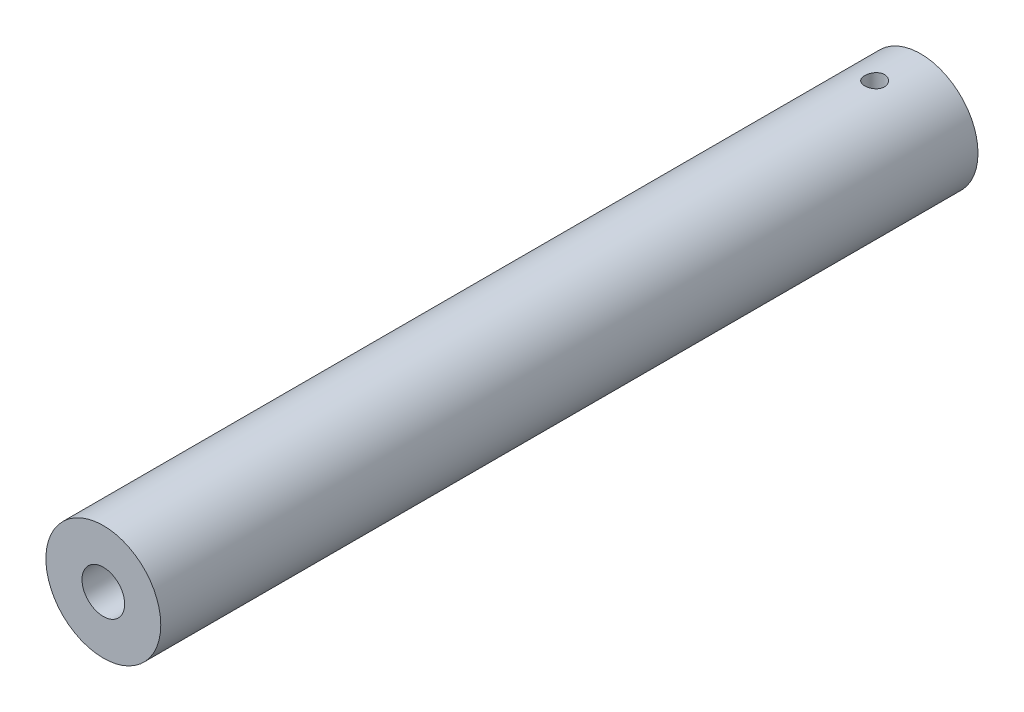
ISO-10303-21;
HEADER;
FILE_DESCRIPTION(('STEP AP214'),'2;1');
FILE_NAME('part.step','',(''),(''),'','','');
FILE_SCHEMA(('AUTOMOTIVE_DESIGN { 1 0 10303 214 1 1 1 1 }'));
ENDSEC;
DATA;
#1=APPLICATION_CONTEXT('core data for automotive mechanical design processes');
#2=APPLICATION_PROTOCOL_DEFINITION('international standard','automotive_design',2000,#1);
#3=PRODUCT_CONTEXT('',#1,'mechanical');
#4=PRODUCT('Part','Part','',(#3));
#5=PRODUCT_RELATED_PRODUCT_CATEGORY('part','',(#4));
#6=PRODUCT_DEFINITION_FORMATION('','',#4);
#7=PRODUCT_DEFINITION_CONTEXT('part definition',#1,'design');
#8=PRODUCT_DEFINITION('design','',#6,#7);
#9=PRODUCT_DEFINITION_SHAPE('','',#8);
#10=(LENGTH_UNIT() NAMED_UNIT(*) SI_UNIT(.MILLI.,.METRE.));
#11=(NAMED_UNIT(*) PLANE_ANGLE_UNIT() SI_UNIT($,.RADIAN.));
#12=(NAMED_UNIT(*) SI_UNIT($,.STERADIAN.) SOLID_ANGLE_UNIT());
#13=UNCERTAINTY_MEASURE_WITH_UNIT(LENGTH_MEASURE(1.E-05),#10,'distance_accuracy_value','');
#14=(GEOMETRIC_REPRESENTATION_CONTEXT(3) GLOBAL_UNCERTAINTY_ASSIGNED_CONTEXT((#13)) GLOBAL_UNIT_ASSIGNED_CONTEXT((#10,
#11,#12)) REPRESENTATION_CONTEXT('',''));
#15=CARTESIAN_POINT('',(0.,0.,0.));
#16=DIRECTION('',(0.,0.,1.));
#17=DIRECTION('',(1.,0.,0.));
#18=AXIS2_PLACEMENT_3D('',#15,#16,#17);
#19=CARTESIAN_POINT('',(0.,0.,249.));
#20=DIRECTION('',(0.,0.,-1.));
#21=DIRECTION('',(-1.,0.,0.));
#22=AXIS2_PLACEMENT_3D('',#19,#20,#21);
#23=CYLINDRICAL_SURFACE('',#22,17.5);
#24=CARTESIAN_POINT('',(0.,-17.5,17.));
#25=CARTESIAN_POINT('',(0.167197888477242,-17.4999970906634,16.9999933600278));
#26=CARTESIAN_POINT('',(0.334485258143132,-17.4975789341583,16.9859752108854));
#27=CARTESIAN_POINT('',(0.664363255770978,-17.4881653307871,16.9302990995645));
#28=CARTESIAN_POINT('',(0.826949503842277,-17.4811657504724,16.8886161772203));
#29=CARTESIAN_POINT('',(1.14260529013332,-17.4633739362553,16.7789100860477));
#30=CARTESIAN_POINT('',(1.29568266742598,-17.4525848765595,16.7109089574683));
#31=CARTESIAN_POINT('',(1.58823673724716,-17.4283986081642,16.5505555597663));
#32=CARTESIAN_POINT('',(1.72771488279892,-17.4150016785645,16.458205896101));
#33=CARTESIAN_POINT('',(1.99053687981522,-17.3869322580543,16.2507861471618));
#34=CARTESIAN_POINT('',(2.11372361591322,-17.3722493384791,16.1355183708706));
#35=CARTESIAN_POINT('',(2.33910834882426,-17.3433420797551,15.8859599013705));
#36=CARTESIAN_POINT('',(2.44130498247174,-17.3291177704403,15.7516679736276));
#37=CARTESIAN_POINT('',(2.62244343427673,-17.3026372057527,15.4667871106238));
#38=CARTESIAN_POINT('',(2.70122890432628,-17.2903944202576,15.3160974015625));
#39=CARTESIAN_POINT('',(2.8323085511595,-17.2694082884627,15.0033773729284));
#40=CARTESIAN_POINT('',(2.88460462423909,-17.2606646916761,14.8413478660828));
#41=CARTESIAN_POINT('',(2.96072391561323,-17.2477710031912,14.512216683497));
#42=CARTESIAN_POINT('',(2.98481900474365,-17.243577079757,14.3451796341587));
#43=CARTESIAN_POINT('',(3.00469550116558,-17.2401251006059,14.0093848650819));
#44=CARTESIAN_POINT('',(3.00047902833606,-17.2408666753347,13.8406272751167));
#45=CARTESIAN_POINT('',(2.9640733197104,-17.247161908727,13.5081288601554));
#46=CARTESIAN_POINT('',(2.93219030257035,-17.2526628874287,13.3443533638215));
#47=CARTESIAN_POINT('',(2.84183747786595,-17.2677745842644,13.0245110835719));
#48=CARTESIAN_POINT('',(2.78336671037819,-17.277385450781,12.8684445782071));
#49=CARTESIAN_POINT('',(2.64119011069865,-17.2996905267923,12.5675382567532));
#50=CARTESIAN_POINT('',(2.55735789103785,-17.3124001155707,12.4227593449751));
#51=CARTESIAN_POINT('',(2.36692773155713,-17.3394600238194,12.1492075297542));
#52=CARTESIAN_POINT('',(2.26032785038532,-17.3538104831548,12.0204359927096));
#53=CARTESIAN_POINT('',(2.02572372299599,-17.3827662542506,11.7807824440492));
#54=CARTESIAN_POINT('',(1.89745691927206,-17.3973724389321,11.6701574024581));
#55=CARTESIAN_POINT('',(1.62404588495938,-17.425020040751,11.4719605487683));
#56=CARTESIAN_POINT('',(1.47890153361697,-17.4380614466915,11.3843889016243));
#57=CARTESIAN_POINT('',(1.17560813403869,-17.4611302114515,11.2347581509096));
#58=CARTESIAN_POINT('',(1.01744722776392,-17.4711547823576,11.1727226263943));
#59=CARTESIAN_POINT('',(0.692740844795707,-17.4870382024854,11.0761681973231));
#60=CARTESIAN_POINT('',(0.526196112090001,-17.4928974206486,11.0416468556962));
#61=CARTESIAN_POINT('',(0.191663620946767,-17.4997401167391,11.0014511151014));
#62=CARTESIAN_POINT('',(0.0237194081687678,-17.5007831904569,10.9954241000042));
#63=CARTESIAN_POINT('',(-0.310778590563215,-17.4980396044024,11.0114467485454));
#64=CARTESIAN_POINT('',(-0.477332432950727,-17.4942531416242,11.0334952669981));
#65=CARTESIAN_POINT('',(-0.803226267811299,-17.4823128742762,11.1047498321256));
#66=CARTESIAN_POINT('',(-0.962605737440311,-17.474187289333,11.153780461942));
#67=CARTESIAN_POINT('',(-1.27088253097933,-17.4544761572207,11.2774198329742));
#68=CARTESIAN_POINT('',(-1.41977923763672,-17.4428904065181,11.3520300788691));
#69=CARTESIAN_POINT('',(-1.70438969290455,-17.417396034143,11.5255124168742));
#70=CARTESIAN_POINT('',(-1.83996793782046,-17.4034668086373,11.6246037256824));
#71=CARTESIAN_POINT('',(-2.09269752640408,-17.374890575826,11.8439348823244));
#72=CARTESIAN_POINT('',(-2.20984744764914,-17.3602435132271,11.9641763611556));
#73=CARTESIAN_POINT('',(-2.42370922919042,-17.3316886120672,12.2239794885671));
#74=CARTESIAN_POINT('',(-2.52018230406535,-17.3177906676551,12.3637389587985));
#75=CARTESIAN_POINT('',(-2.68828177195729,-17.2924954044816,12.6576872266061));
#76=CARTESIAN_POINT('',(-2.75990898496466,-17.2810980031992,12.8118755477721));
#77=CARTESIAN_POINT('',(-2.87593039066209,-17.2621692769636,13.1296504802955));
#78=CARTESIAN_POINT('',(-2.92044137511779,-17.2546213950509,13.2931934191781));
#79=CARTESIAN_POINT('',(-2.98133287310577,-17.2442055530579,13.6255754658077));
#80=CARTESIAN_POINT('',(-2.99771598859209,-17.2413371601052,13.7944140822093));
#81=CARTESIAN_POINT('',(-3.00181092557774,-17.2406244562009,14.1302088113891));
#82=CARTESIAN_POINT('',(-2.98989876393497,-17.2427142552452,14.2971603173207));
#83=CARTESIAN_POINT('',(-2.93855658141656,-17.2515376902196,14.6266455162757));
#84=CARTESIAN_POINT('',(-2.89912666495964,-17.2582713085282,14.7891792260605));
#85=CARTESIAN_POINT('',(-2.79401555437729,-17.2755980335454,15.1050572185084));
#86=CARTESIAN_POINT('',(-2.72836856938937,-17.2861861092089,15.258413178014));
#87=CARTESIAN_POINT('',(-2.57272591738777,-17.3100332980519,15.5519955543147));
#88=CARTESIAN_POINT('',(-2.4827289285662,-17.323292556223,15.6922212577946));
#89=CARTESIAN_POINT('',(-2.27960652854412,-17.3511960758331,15.9574589102658));
#90=CARTESIAN_POINT('',(-2.16620511263839,-17.3658556265499,16.0822579145627));
#91=CARTESIAN_POINT('',(-1.92007371238758,-17.3947877125717,16.3111832611682));
#92=CARTESIAN_POINT('',(-1.78733928025448,-17.4090601579197,16.4153048333269));
#93=CARTESIAN_POINT('',(-1.50514767837312,-17.4357318551825,16.6006229221308));
#94=CARTESIAN_POINT('',(-1.35557476659934,-17.4481165680147,16.6816453138));
#95=CARTESIAN_POINT('',(-1.0447868677741,-17.4694759066054,16.8172876836026));
#96=CARTESIAN_POINT('',(-0.88358351302067,-17.4784538848809,16.8719336328885));
#97=CARTESIAN_POINT('',(-0.601487930679761,-17.4900568902174,16.9415768670966));
#98=CARTESIAN_POINT('',(-0.482290496810161,-17.4937653830011,16.9634499488919));
#99=CARTESIAN_POINT('',(-0.242077656560215,-17.4987379681287,16.9926637822594));
#100=CARTESIAN_POINT('',(-0.121062284493384,-17.5000021065514,17.0000048077773));
#101=CARTESIAN_POINT('',(0.,-17.5,17.));
#102=B_SPLINE_CURVE_WITH_KNOTS('',3,(#24,#25,#26,#27,#28,#29,#30,#31,#32,#33,#34,#35,#36,#37,
#38,#39,#40,#41,#42,#43,#44,#45,#46,#47,#48,#49,#50,#51,#52,#53,#54,#55,#56,#57,#58,#59,#60,#61,
#62,#63,#64,#65,#66,#67,#68,#69,#70,#71,#72,#73,#74,#75,#76,#77,#78,#79,#80,#81,#82,#83,#84,#85,
#86,#87,#88,#89,#90,#91,#92,#93,#94,#95,#96,#97,#98,#99,#100,#101),.UNSPECIFIED.,.T.,.F.,(4,2,2,
2,2,2,2,2,2,2,2,2,2,2,2,2,2,2,2,2,2,2,2,2,2,2,2,2,2,2,2,2,2,2,2,2,2,2,4),(0.,0.501151101757203,
1.00275497607122,1.50393968673033,2.00507078900044,2.5107284354123,3.01641891050083,
3.52541434956454,4.03437334603057,4.53838423155782,5.04235737878726,5.54082259089734,
6.03930580101093,6.54031528278254,7.04136750167458,7.54899572691696,8.05662758430693,
8.56472712329613,9.07278165232261,9.57453227491966,10.076262432039,10.5747686152101,
11.0733041272271,11.5764767729204,12.0796882378443,12.5884304724088,13.0971559153069,
13.6036744532888,14.1101461335088,14.6099250273454,15.1097020247342,15.6088290116353,
16.1079830984257,16.6133996019155,17.1189325666264,17.6281812174477,18.1369274164456,
18.4998006653088,18.8626670735372),.UNSPECIFIED.);
#103=CARTESIAN_POINT('',(0.,-17.5,17.));
#104=VERTEX_POINT('',#103);
#105=EDGE_CURVE('E77',#104,#104,#102,.T.);
#106=ORIENTED_EDGE('',*,*,#105,.T.);
#107=EDGE_LOOP('',(#106));
#108=FACE_BOUND('',#107,.T.);
#109=CARTESIAN_POINT('',(0.,17.5,17.));
#110=CARTESIAN_POINT('',(-0.167197888477242,17.4999970906634,16.9999933600278));
#111=CARTESIAN_POINT('',(-0.334485258143132,17.4975789341583,16.9859752108854));
#112=CARTESIAN_POINT('',(-0.664363255770978,17.4881653307871,16.9302990995645));
#113=CARTESIAN_POINT('',(-0.826949503842277,17.4811657504724,16.8886161772203));
#114=CARTESIAN_POINT('',(-1.14260529013332,17.4633739362553,16.7789100860477));
#115=CARTESIAN_POINT('',(-1.29568266742598,17.4525848765595,16.7109089574683));
#116=CARTESIAN_POINT('',(-1.58823673724716,17.4283986081642,16.5505555597663));
#117=CARTESIAN_POINT('',(-1.72771488279892,17.4150016785645,16.458205896101));
#118=CARTESIAN_POINT('',(-1.99053687981522,17.3869322580543,16.2507861471618));
#119=CARTESIAN_POINT('',(-2.11372361591322,17.3722493384791,16.1355183708706));
#120=CARTESIAN_POINT('',(-2.33910834882426,17.3433420797551,15.8859599013705));
#121=CARTESIAN_POINT('',(-2.44130498247174,17.3291177704403,15.7516679736276));
#122=CARTESIAN_POINT('',(-2.62244343427673,17.3026372057527,15.4667871106238));
#123=CARTESIAN_POINT('',(-2.70122890432628,17.2903944202576,15.3160974015625));
#124=CARTESIAN_POINT('',(-2.8323085511595,17.2694082884627,15.0033773729284));
#125=CARTESIAN_POINT('',(-2.88460462423909,17.2606646916761,14.8413478660828));
#126=CARTESIAN_POINT('',(-2.96072391561323,17.2477710031912,14.512216683497));
#127=CARTESIAN_POINT('',(-2.98481900474365,17.243577079757,14.3451796341587));
#128=CARTESIAN_POINT('',(-3.00469550116558,17.2401251006059,14.0093848650819));
#129=CARTESIAN_POINT('',(-3.00047902833606,17.2408666753347,13.8406272751167));
#130=CARTESIAN_POINT('',(-2.9640733197104,17.247161908727,13.5081288601554));
#131=CARTESIAN_POINT('',(-2.93219030257035,17.2526628874287,13.3443533638215));
#132=CARTESIAN_POINT('',(-2.84183747786595,17.2677745842644,13.0245110835719));
#133=CARTESIAN_POINT('',(-2.78336671037819,17.277385450781,12.8684445782071));
#134=CARTESIAN_POINT('',(-2.64119011069865,17.2996905267923,12.5675382567532));
#135=CARTESIAN_POINT('',(-2.55735789103785,17.3124001155707,12.4227593449751));
#136=CARTESIAN_POINT('',(-2.36692773155713,17.3394600238194,12.1492075297542));
#137=CARTESIAN_POINT('',(-2.26032785038532,17.3538104831548,12.0204359927096));
#138=CARTESIAN_POINT('',(-2.02572372299599,17.3827662542506,11.7807824440492));
#139=CARTESIAN_POINT('',(-1.89745691927206,17.3973724389321,11.6701574024581));
#140=CARTESIAN_POINT('',(-1.62404588495938,17.425020040751,11.4719605487683));
#141=CARTESIAN_POINT('',(-1.47890153361697,17.4380614466915,11.3843889016243));
#142=CARTESIAN_POINT('',(-1.17560813403869,17.4611302114515,11.2347581509096));
#143=CARTESIAN_POINT('',(-1.01744722776392,17.4711547823576,11.1727226263943));
#144=CARTESIAN_POINT('',(-0.692740844795707,17.4870382024854,11.0761681973231));
#145=CARTESIAN_POINT('',(-0.526196112090001,17.4928974206486,11.0416468556962));
#146=CARTESIAN_POINT('',(-0.191663620946767,17.4997401167391,11.0014511151014));
#147=CARTESIAN_POINT('',(-0.0237194081687678,17.5007831904569,10.9954241000042));
#148=CARTESIAN_POINT('',(0.310778590563215,17.4980396044024,11.0114467485454));
#149=CARTESIAN_POINT('',(0.477332432950727,17.4942531416242,11.0334952669981));
#150=CARTESIAN_POINT('',(0.803226267811299,17.4823128742762,11.1047498321256));
#151=CARTESIAN_POINT('',(0.962605737440311,17.474187289333,11.153780461942));
#152=CARTESIAN_POINT('',(1.27088253097933,17.4544761572207,11.2774198329742));
#153=CARTESIAN_POINT('',(1.41977923763672,17.4428904065181,11.3520300788691));
#154=CARTESIAN_POINT('',(1.70438969290455,17.417396034143,11.5255124168742));
#155=CARTESIAN_POINT('',(1.83996793782046,17.4034668086373,11.6246037256824));
#156=CARTESIAN_POINT('',(2.09269752640408,17.374890575826,11.8439348823244));
#157=CARTESIAN_POINT('',(2.20984744764914,17.3602435132271,11.9641763611556));
#158=CARTESIAN_POINT('',(2.42370922919042,17.3316886120672,12.2239794885671));
#159=CARTESIAN_POINT('',(2.52018230406535,17.3177906676551,12.3637389587985));
#160=CARTESIAN_POINT('',(2.68828177195729,17.2924954044816,12.6576872266061));
#161=CARTESIAN_POINT('',(2.75990898496466,17.2810980031992,12.8118755477721));
#162=CARTESIAN_POINT('',(2.87593039066209,17.2621692769636,13.1296504802955));
#163=CARTESIAN_POINT('',(2.92044137511779,17.2546213950509,13.2931934191781));
#164=CARTESIAN_POINT('',(2.98133287310577,17.2442055530579,13.6255754658077));
#165=CARTESIAN_POINT('',(2.99771598859209,17.2413371601052,13.7944140822093));
#166=CARTESIAN_POINT('',(3.00181092557774,17.2406244562009,14.1302088113891));
#167=CARTESIAN_POINT('',(2.98989876393497,17.2427142552452,14.2971603173207));
#168=CARTESIAN_POINT('',(2.93855658141656,17.2515376902196,14.6266455162757));
#169=CARTESIAN_POINT('',(2.89912666495964,17.2582713085282,14.7891792260605));
#170=CARTESIAN_POINT('',(2.79401555437729,17.2755980335454,15.1050572185084));
#171=CARTESIAN_POINT('',(2.72836856938937,17.2861861092089,15.258413178014));
#172=CARTESIAN_POINT('',(2.57272591738777,17.3100332980519,15.5519955543147));
#173=CARTESIAN_POINT('',(2.4827289285662,17.323292556223,15.6922212577946));
#174=CARTESIAN_POINT('',(2.27960652854412,17.3511960758331,15.9574589102658));
#175=CARTESIAN_POINT('',(2.16620511263839,17.3658556265499,16.0822579145627));
#176=CARTESIAN_POINT('',(1.92007371238758,17.3947877125717,16.3111832611682));
#177=CARTESIAN_POINT('',(1.78733928025448,17.4090601579197,16.4153048333269));
#178=CARTESIAN_POINT('',(1.50514767837312,17.4357318551825,16.6006229221308));
#179=CARTESIAN_POINT('',(1.35557476659934,17.4481165680147,16.6816453138));
#180=CARTESIAN_POINT('',(1.0447868677741,17.4694759066054,16.8172876836026));
#181=CARTESIAN_POINT('',(0.88358351302067,17.4784538848809,16.8719336328885));
#182=CARTESIAN_POINT('',(0.601487930679761,17.4900568902174,16.9415768670966));
#183=CARTESIAN_POINT('',(0.482290496810161,17.4937653830011,16.9634499488919));
#184=CARTESIAN_POINT('',(0.242077656560215,17.4987379681287,16.9926637822594));
#185=CARTESIAN_POINT('',(0.121062284493384,17.5000021065514,17.0000048077773));
#186=CARTESIAN_POINT('',(0.,17.5,17.));
#187=B_SPLINE_CURVE_WITH_KNOTS('',3,(#109,#110,#111,#112,#113,#114,#115,#116,#117,#118,#119,
#120,#121,#122,#123,#124,#125,#126,#127,#128,#129,#130,#131,#132,#133,#134,#135,#136,#137,#138,
#139,#140,#141,#142,#143,#144,#145,#146,#147,#148,#149,#150,#151,#152,#153,#154,#155,#156,#157,
#158,#159,#160,#161,#162,#163,#164,#165,#166,#167,#168,#169,#170,#171,#172,#173,#174,#175,#176,
#177,#178,#179,#180,#181,#182,#183,#184,#185,#186),.UNSPECIFIED.,.T.,.F.,(4,2,2,2,2,2,2,2,2,2,2,
2,2,2,2,2,2,2,2,2,2,2,2,2,2,2,2,2,2,2,2,2,2,2,2,2,2,2,4),(0.,0.501151101757203,1.00275497607122,
1.50393968673033,2.00507078900044,2.5107284354123,3.01641891050083,3.52541434956454,
4.03437334603057,4.53838423155782,5.04235737878726,5.54082259089734,6.03930580101093,
6.54031528278254,7.04136750167458,7.54899572691696,8.05662758430693,8.56472712329613,
9.07278165232261,9.57453227491966,10.076262432039,10.5747686152101,11.0733041272271,
11.5764767729204,12.0796882378443,12.5884304724088,13.0971559153069,13.6036744532888,
14.1101461335088,14.6099250273454,15.1097020247342,15.6088290116353,16.1079830984257,
16.6133996019155,17.1189325666264,17.6281812174477,18.1369274164456,18.4998006653088,
18.8626670735372),.UNSPECIFIED.);
#188=CARTESIAN_POINT('',(0.,17.5,17.));
#189=VERTEX_POINT('',#188);
#190=EDGE_CURVE('E73',#189,#189,#187,.T.);
#191=ORIENTED_EDGE('',*,*,#190,.T.);
#192=EDGE_LOOP('',(#191));
#193=FACE_BOUND('',#192,.T.);
#194=CARTESIAN_POINT('',(0.,0.,249.));
#195=DIRECTION('',(0.,0.,1.));
#196=DIRECTION('',(1.,0.,0.));
#197=AXIS2_PLACEMENT_3D('',#194,#195,#196);
#198=CIRCLE('',#197,17.5);
#199=CARTESIAN_POINT('',(17.5,0.,249.));
#200=VERTEX_POINT('',#199);
#201=EDGE_CURVE('E10',#200,#200,#198,.T.);
#202=ORIENTED_EDGE('',*,*,#201,.F.);
#203=EDGE_LOOP('',(#202));
#204=FACE_BOUND('',#203,.T.);
#205=CARTESIAN_POINT('',(0.,0.,0.));
#206=DIRECTION('',(0.,0.,1.));
#207=DIRECTION('',(1.,0.,0.));
#208=AXIS2_PLACEMENT_3D('',#205,#206,#207);
#209=CIRCLE('',#208,17.5);
#210=CARTESIAN_POINT('',(17.5,0.,0.));
#211=VERTEX_POINT('',#210);
#212=EDGE_CURVE('E44',#211,#211,#209,.T.);
#213=ORIENTED_EDGE('',*,*,#212,.T.);
#214=EDGE_LOOP('',(#213));
#215=FACE_BOUND('',#214,.T.);
#216=ADVANCED_FACE('F32',(#108,#193,#204,#215),#23,.T.);
#217=CARTESIAN_POINT('',(0.,0.,249.));
#218=DIRECTION('',(0.,0.,1.));
#219=DIRECTION('',(1.,0.,0.));
#220=AXIS2_PLACEMENT_3D('',#217,#218,#219);
#221=PLANE('',#220);
#222=CARTESIAN_POINT('',(0.,0.,249.));
#223=DIRECTION('',(0.,0.,1.));
#224=DIRECTION('',(1.,0.,0.));
#225=AXIS2_PLACEMENT_3D('',#222,#223,#224);
#226=CIRCLE('',#225,6.5);
#227=CARTESIAN_POINT('',(6.5,0.,249.));
#228=VERTEX_POINT('',#227);
#229=EDGE_CURVE('E52',#228,#228,#226,.T.);
#230=ORIENTED_EDGE('',*,*,#229,.F.);
#231=EDGE_LOOP('',(#230));
#232=FACE_BOUND('',#231,.T.);
#233=ORIENTED_EDGE('',*,*,#201,.T.);
#234=EDGE_LOOP('',(#233));
#235=FACE_BOUND('',#234,.T.);
#236=ADVANCED_FACE('F95',(#232,#235),#221,.T.);
#237=CARTESIAN_POINT('',(0.,0.,0.));
#238=DIRECTION('',(0.,0.,1.));
#239=DIRECTION('',(1.,0.,0.));
#240=AXIS2_PLACEMENT_3D('',#237,#238,#239);
#241=PLANE('',#240);
#242=CARTESIAN_POINT('',(0.,0.,0.));
#243=DIRECTION('',(0.,0.,-1.));
#244=DIRECTION('',(-1.,0.,0.));
#245=AXIS2_PLACEMENT_3D('',#242,#243,#244);
#246=CIRCLE('',#245,10.);
#247=CARTESIAN_POINT('',(-10.,0.,0.));
#248=VERTEX_POINT('',#247);
#249=EDGE_CURVE('E82',#248,#248,#246,.T.);
#250=ORIENTED_EDGE('',*,*,#249,.F.);
#251=EDGE_LOOP('',(#250));
#252=FACE_BOUND('',#251,.T.);
#253=ORIENTED_EDGE('',*,*,#212,.F.);
#254=EDGE_LOOP('',(#253));
#255=FACE_BOUND('',#254,.T.);
#256=ADVANCED_FACE('F97',(#252,#255),#241,.F.);
#257=CARTESIAN_POINT('',(0.,0.,194.));
#258=DIRECTION('',(0.,0.,1.));
#259=DIRECTION('',(1.,0.,0.));
#260=AXIS2_PLACEMENT_3D('',#257,#258,#259);
#261=CYLINDRICAL_SURFACE('',#260,6.5);
#262=CARTESIAN_POINT('',(0.,0.,194.));
#263=DIRECTION('',(0.,0.,1.));
#264=DIRECTION('',(1.,0.,0.));
#265=AXIS2_PLACEMENT_3D('',#262,#263,#264);
#266=CIRCLE('',#265,6.5);
#267=CARTESIAN_POINT('',(6.5,0.,194.));
#268=VERTEX_POINT('',#267);
#269=EDGE_CURVE('E49',#268,#268,#266,.T.);
#270=ORIENTED_EDGE('',*,*,#269,.F.);
#271=EDGE_LOOP('',(#270));
#272=FACE_BOUND('',#271,.T.);
#273=ORIENTED_EDGE('',*,*,#229,.T.);
#274=EDGE_LOOP('',(#273));
#275=FACE_BOUND('',#274,.T.);
#276=ADVANCED_FACE('F93',(#272,#275),#261,.F.);
#277=CARTESIAN_POINT('',(0.,0.,194.));
#278=DIRECTION('',(0.,0.,1.));
#279=DIRECTION('',(1.,0.,0.));
#280=AXIS2_PLACEMENT_3D('',#277,#278,#279);
#281=PLANE('',#280);
#282=ORIENTED_EDGE('',*,*,#269,.T.);
#283=EDGE_LOOP('',(#282));
#284=FACE_BOUND('',#283,.T.);
#285=ADVANCED_FACE('F107',(#284),#281,.T.);
#286=CARTESIAN_POINT('',(0.,0.,50.));
#287=DIRECTION('',(0.,0.,-1.));
#288=DIRECTION('',(-1.,0.,0.));
#289=AXIS2_PLACEMENT_3D('',#286,#287,#288);
#290=CYLINDRICAL_SURFACE('',#289,10.);
#291=CARTESIAN_POINT('',(0.,-10.,17.));
#292=CARTESIAN_POINT('',(-0.1645772255066,-9.99999858501101,16.9999980050302));
#293=CARTESIAN_POINT('',(-0.329174636703059,-9.99589831387907,16.9864122727521));
#294=CARTESIAN_POINT('',(-0.653576250609761,-9.97994211187382,16.9325572915558));
#295=CARTESIAN_POINT('',(-0.81337900882284,-9.96808386779384,16.8922800839533));
#296=CARTESIAN_POINT('',(-1.12346541550905,-9.93791105003673,16.7865079661795));
#297=CARTESIAN_POINT('',(-1.27376272879075,-9.91960600500851,16.7210502607621));
#298=CARTESIAN_POINT('',(-1.56124836210626,-9.87844218475291,16.5669278138883));
#299=CARTESIAN_POINT('',(-1.69843493493934,-9.85558280384133,16.4782599852092));
#300=CARTESIAN_POINT('',(-1.95974359436749,-9.80701474385548,16.2775519850547));
#301=CARTESIAN_POINT('',(-2.08343614248868,-9.78124767314073,16.1649667482282));
#302=CARTESIAN_POINT('',(-2.31049841846647,-9.73011668420884,15.9207815401796));
#303=CARTESIAN_POINT('',(-2.41386472654882,-9.70475283449003,15.7891783757501));
#304=CARTESIAN_POINT('',(-2.59960075447415,-9.65668227987544,15.5070584939248));
#305=CARTESIAN_POINT('',(-2.68144618044427,-9.63404813327749,15.3561830780185));
#306=CARTESIAN_POINT('',(-2.81842789549521,-9.59487240788062,15.0420214915394));
#307=CARTESIAN_POINT('',(-2.87357059839947,-9.57832936626621,14.878738312144));
#308=CARTESIAN_POINT('',(-2.95403267365303,-9.55381741676868,14.5492194677391));
#309=CARTESIAN_POINT('',(-2.98014392469355,-9.54562138649067,14.3831945122721));
#310=CARTESIAN_POINT('',(-3.00427461229344,-9.53805579499534,14.0489336875665));
#311=CARTESIAN_POINT('',(-3.00230085522157,-9.53868409521142,13.8806983638818));
#312=CARTESIAN_POINT('',(-2.97093954399623,-9.54849488135555,13.553232182783));
#313=CARTESIAN_POINT('',(-2.9425441052537,-9.55736777198281,13.3938954992755));
#314=CARTESIAN_POINT('',(-2.86074840854112,-9.58216712457248,13.0823604274531));
#315=CARTESIAN_POINT('',(-2.80734568283282,-9.59809428264701,12.9301627452513));
#316=CARTESIAN_POINT('',(-2.67632053307363,-9.63545466149946,12.6347993006785));
#317=CARTESIAN_POINT('',(-2.59837633869285,-9.65696032231904,12.4917858320895));
#318=CARTESIAN_POINT('',(-2.42070445177367,-9.70301974000129,12.2205359559796));
#319=CARTESIAN_POINT('',(-2.32097148005177,-9.72757423493982,12.0923031411724));
#320=CARTESIAN_POINT('',(-2.09762581531092,-9.77822022595875,11.848627618476));
#321=CARTESIAN_POINT('',(-1.97318981493394,-9.80433308620996,11.7339426719407));
#322=CARTESIAN_POINT('',(-1.70652651862793,-9.85424488126517,11.5268920318715));
#323=CARTESIAN_POINT('',(-1.56429810372177,-9.8780436703682,11.4345277431711));
#324=CARTESIAN_POINT('',(-1.2647100766856,-9.92086320138941,11.2742801550705));
#325=CARTESIAN_POINT('',(-1.1072554994959,-9.93985087336628,11.2065649675003));
#326=CARTESIAN_POINT('',(-0.782490831207037,-9.97067043664444,11.0988008198007));
#327=CARTESIAN_POINT('',(-0.615183503179161,-9.98250432373999,11.058744142935));
#328=CARTESIAN_POINT('',(-0.281904485336661,-9.99736729287077,11.0086956442012));
#329=CARTESIAN_POINT('',(-0.116100195202372,-10.0006970083558,10.9976768283968));
#330=CARTESIAN_POINT('',(0.214999211646768,-9.99905846483519,11.0031383114242));
#331=CARTESIAN_POINT('',(0.380294393381563,-9.99409131355514,11.0196149393029));
#332=CARTESIAN_POINT('',(0.701807210619395,-9.97661393974325,11.078769222223));
#333=CARTESIAN_POINT('',(0.85814554522834,-9.96427659598829,11.1208467751617));
#334=CARTESIAN_POINT('',(1.16150927790905,-9.9334869568307,11.2292864655564));
#335=CARTESIAN_POINT('',(1.30853355405117,-9.91503392642188,11.2956515220757));
#336=CARTESIAN_POINT('',(1.5928743789221,-9.87339308702631,11.4525063309623));
#337=CARTESIAN_POINT('',(1.72988765239934,-9.8501056165928,11.543518681896));
#338=CARTESIAN_POINT('',(1.9870466159603,-9.80146937528705,11.7464495081056));
#339=CARTESIAN_POINT('',(2.10718806471188,-9.7761200886242,11.8583732237753));
#340=CARTESIAN_POINT('',(2.33171489102052,-9.72506343738007,12.1047746167387));
#341=CARTESIAN_POINT('',(2.43536962463001,-9.69937650065513,12.2399237515437));
#342=CARTESIAN_POINT('',(2.61857990144313,-9.65153030477949,12.5262558780269));
#343=CARTESIAN_POINT('',(2.69813607658965,-9.62937095313121,12.6774384491158));
#344=CARTESIAN_POINT('',(2.83034694254316,-9.5913437922631,12.99106498251));
#345=CARTESIAN_POINT('',(2.88312693874022,-9.57544675673501,13.1534523730757));
#346=CARTESIAN_POINT('',(2.96043461630306,-9.55183188739737,13.4853759378605));
#347=CARTESIAN_POINT('',(2.98497197957849,-9.54411125069387,13.6549096415661));
#348=CARTESIAN_POINT('',(3.0044396896993,-9.53799944941558,13.9887230367768));
#349=CARTESIAN_POINT('',(3.00056110615887,-9.53923294700394,14.1529273020988));
#350=CARTESIAN_POINT('',(2.9661501088861,-9.54998802392188,14.4782282068012));
#351=CARTESIAN_POINT('',(2.93561876249407,-9.55950927135902,14.639324970361));
#352=CARTESIAN_POINT('',(2.84953777608686,-9.58551527389243,14.9518907982633));
#353=CARTESIAN_POINT('',(2.79430351014248,-9.60191209104934,15.1034545747174));
#354=CARTESIAN_POINT('',(2.66063014242147,-9.63980557805265,15.3952848776414));
#355=CARTESIAN_POINT('',(2.58218659925722,-9.6613032238508,15.5355492352831));
#356=CARTESIAN_POINT('',(2.40097527610175,-9.70795352855338,15.8063262330525));
#357=CARTESIAN_POINT('',(2.29742552185996,-9.7332108032858,15.9362975225204));
#358=CARTESIAN_POINT('',(2.07034869259555,-9.78402640899066,16.1774049966162));
#359=CARTESIAN_POINT('',(1.94681643426898,-9.80958481647543,16.2885362789356));
#360=CARTESIAN_POINT('',(1.67893152436652,-9.85901873141573,16.4920468245899));
#361=CARTESIAN_POINT('',(1.53407577158122,-9.88282319531422,16.5837828937109));
#362=CARTESIAN_POINT('',(1.23028274796705,-9.92521360911553,16.7414703398081));
#363=CARTESIAN_POINT('',(1.07135210599791,-9.94380199862114,16.807433776549));
#364=CARTESIAN_POINT('',(0.761515425310563,-9.97204349938619,16.9057905513055));
#365=CARTESIAN_POINT('',(0.611573923908468,-9.9824405476214,16.9410233457665));
#366=CARTESIAN_POINT('',(0.307760390461558,-9.9964188898898,16.9881270504832));
#367=CARTESIAN_POINT('',(0.153889019716279,-10.0000013230948,17.0000018654096));
#368=CARTESIAN_POINT('',(0.,-10.,17.));
#369=B_SPLINE_CURVE_WITH_KNOTS('',3,(#291,#292,#293,#294,#295,#296,#297,#298,#299,#300,#301,
#302,#303,#304,#305,#306,#307,#308,#309,#310,#311,#312,#313,#314,#315,#316,#317,#318,#319,#320,
#321,#322,#323,#324,#325,#326,#327,#328,#329,#330,#331,#332,#333,#334,#335,#336,#337,#338,#339,
#340,#341,#342,#343,#344,#345,#346,#347,#348,#349,#350,#351,#352,#353,#354,#355,#356,#357,#358,
#359,#360,#361,#362,#363,#364,#365,#366,#367,#368),.UNSPECIFIED.,.T.,.F.,(4,2,2,2,2,2,2,2,2,2,2,
2,2,2,2,2,2,2,2,2,2,2,2,2,2,2,2,2,2,2,2,2,2,2,2,2,2,2,4),(0.,0.493166407225221,
0.986479929691999,1.47906735260175,1.9717203288254,2.47711205896383,2.98258874577266,
3.49942962008218,4.01614629086447,4.51839378713198,5.02051956638179,5.50452033395352,
5.98856887316003,6.47924852894239,6.97004720317111,7.48134208096333,7.99266913062143,
8.50742093763377,9.02202907057615,9.5181761887709,10.0142570710065,10.4991349336465,
10.9840710918746,11.4802261140582,11.9765056400038,12.4908080064564,13.0050968850536,
13.516956299025,14.0286401892057,14.5190031093854,15.0093463933232,15.4936008081456,
15.9779479511533,16.4799385136898,16.9820594980413,17.4988599232246,18.0154182319959,
18.4766338387004,18.9377723390687),.UNSPECIFIED.);
#370=CARTESIAN_POINT('',(0.,-10.,17.));
#371=VERTEX_POINT('',#370);
#372=EDGE_CURVE('E36',#371,#371,#369,.T.);
#373=ORIENTED_EDGE('',*,*,#372,.T.);
#374=EDGE_LOOP('',(#373));
#375=FACE_BOUND('',#374,.T.);
#376=CARTESIAN_POINT('',(0.,10.,17.));
#377=CARTESIAN_POINT('',(0.1645772255066,9.99999858501101,16.9999980050302));
#378=CARTESIAN_POINT('',(0.329174636703059,9.99589831387907,16.9864122727521));
#379=CARTESIAN_POINT('',(0.653576250609761,9.97994211187382,16.9325572915558));
#380=CARTESIAN_POINT('',(0.81337900882284,9.96808386779384,16.8922800839533));
#381=CARTESIAN_POINT('',(1.12346541550905,9.93791105003673,16.7865079661795));
#382=CARTESIAN_POINT('',(1.27376272879075,9.91960600500851,16.7210502607621));
#383=CARTESIAN_POINT('',(1.56124836210626,9.87844218475291,16.5669278138883));
#384=CARTESIAN_POINT('',(1.69843493493934,9.85558280384133,16.4782599852092));
#385=CARTESIAN_POINT('',(1.95974359436749,9.80701474385548,16.2775519850547));
#386=CARTESIAN_POINT('',(2.08343614248868,9.78124767314073,16.1649667482282));
#387=CARTESIAN_POINT('',(2.31049841846647,9.73011668420884,15.9207815401796));
#388=CARTESIAN_POINT('',(2.41386472654882,9.70475283449003,15.7891783757501));
#389=CARTESIAN_POINT('',(2.59960075447415,9.65668227987544,15.5070584939248));
#390=CARTESIAN_POINT('',(2.68144618044427,9.63404813327749,15.3561830780185));
#391=CARTESIAN_POINT('',(2.81842789549521,9.59487240788062,15.0420214915394));
#392=CARTESIAN_POINT('',(2.87357059839947,9.57832936626621,14.878738312144));
#393=CARTESIAN_POINT('',(2.95403267365303,9.55381741676868,14.5492194677391));
#394=CARTESIAN_POINT('',(2.98014392469355,9.54562138649067,14.3831945122721));
#395=CARTESIAN_POINT('',(3.00427461229344,9.53805579499534,14.0489336875665));
#396=CARTESIAN_POINT('',(3.00230085522157,9.53868409521142,13.8806983638818));
#397=CARTESIAN_POINT('',(2.97093954399623,9.54849488135555,13.553232182783));
#398=CARTESIAN_POINT('',(2.9425441052537,9.55736777198281,13.3938954992755));
#399=CARTESIAN_POINT('',(2.86074840854112,9.58216712457248,13.0823604274531));
#400=CARTESIAN_POINT('',(2.80734568283282,9.59809428264701,12.9301627452513));
#401=CARTESIAN_POINT('',(2.67632053307363,9.63545466149946,12.6347993006785));
#402=CARTESIAN_POINT('',(2.59837633869285,9.65696032231904,12.4917858320895));
#403=CARTESIAN_POINT('',(2.42070445177367,9.70301974000129,12.2205359559796));
#404=CARTESIAN_POINT('',(2.32097148005177,9.72757423493982,12.0923031411724));
#405=CARTESIAN_POINT('',(2.09762581531092,9.77822022595875,11.848627618476));
#406=CARTESIAN_POINT('',(1.97318981493394,9.80433308620996,11.7339426719407));
#407=CARTESIAN_POINT('',(1.70652651862793,9.85424488126517,11.5268920318715));
#408=CARTESIAN_POINT('',(1.56429810372177,9.8780436703682,11.4345277431711));
#409=CARTESIAN_POINT('',(1.2647100766856,9.92086320138941,11.2742801550705));
#410=CARTESIAN_POINT('',(1.1072554994959,9.93985087336628,11.2065649675003));
#411=CARTESIAN_POINT('',(0.782490831207037,9.97067043664444,11.0988008198007));
#412=CARTESIAN_POINT('',(0.615183503179161,9.98250432373999,11.058744142935));
#413=CARTESIAN_POINT('',(0.281904485336661,9.99736729287077,11.0086956442012));
#414=CARTESIAN_POINT('',(0.116100195202372,10.0006970083558,10.9976768283968));
#415=CARTESIAN_POINT('',(-0.214999211646768,9.99905846483519,11.0031383114242));
#416=CARTESIAN_POINT('',(-0.380294393381563,9.99409131355514,11.0196149393029));
#417=CARTESIAN_POINT('',(-0.701807210619395,9.97661393974325,11.078769222223));
#418=CARTESIAN_POINT('',(-0.85814554522834,9.96427659598829,11.1208467751617));
#419=CARTESIAN_POINT('',(-1.16150927790905,9.9334869568307,11.2292864655564));
#420=CARTESIAN_POINT('',(-1.30853355405117,9.91503392642188,11.2956515220757));
#421=CARTESIAN_POINT('',(-1.5928743789221,9.87339308702631,11.4525063309623));
#422=CARTESIAN_POINT('',(-1.72988765239934,9.8501056165928,11.543518681896));
#423=CARTESIAN_POINT('',(-1.9870466159603,9.80146937528705,11.7464495081056));
#424=CARTESIAN_POINT('',(-2.10718806471188,9.7761200886242,11.8583732237753));
#425=CARTESIAN_POINT('',(-2.33171489102052,9.72506343738007,12.1047746167387));
#426=CARTESIAN_POINT('',(-2.43536962463001,9.69937650065513,12.2399237515437));
#427=CARTESIAN_POINT('',(-2.61857990144313,9.65153030477949,12.5262558780269));
#428=CARTESIAN_POINT('',(-2.69813607658965,9.62937095313121,12.6774384491158));
#429=CARTESIAN_POINT('',(-2.83034694254316,9.5913437922631,12.99106498251));
#430=CARTESIAN_POINT('',(-2.88312693874022,9.57544675673501,13.1534523730757));
#431=CARTESIAN_POINT('',(-2.96043461630306,9.55183188739737,13.4853759378605));
#432=CARTESIAN_POINT('',(-2.98497197957849,9.54411125069387,13.6549096415661));
#433=CARTESIAN_POINT('',(-3.0044396896993,9.53799944941558,13.9887230367768));
#434=CARTESIAN_POINT('',(-3.00056110615887,9.53923294700394,14.1529273020988));
#435=CARTESIAN_POINT('',(-2.9661501088861,9.54998802392188,14.4782282068012));
#436=CARTESIAN_POINT('',(-2.93561876249407,9.55950927135902,14.639324970361));
#437=CARTESIAN_POINT('',(-2.84953777608686,9.58551527389243,14.9518907982633));
#438=CARTESIAN_POINT('',(-2.79430351014248,9.60191209104934,15.1034545747174));
#439=CARTESIAN_POINT('',(-2.66063014242147,9.63980557805265,15.3952848776414));
#440=CARTESIAN_POINT('',(-2.58218659925722,9.6613032238508,15.5355492352831));
#441=CARTESIAN_POINT('',(-2.40097527610175,9.70795352855338,15.8063262330525));
#442=CARTESIAN_POINT('',(-2.29742552185996,9.7332108032858,15.9362975225204));
#443=CARTESIAN_POINT('',(-2.07034869259555,9.78402640899066,16.1774049966162));
#444=CARTESIAN_POINT('',(-1.94681643426898,9.80958481647543,16.2885362789356));
#445=CARTESIAN_POINT('',(-1.67893152436652,9.85901873141573,16.4920468245899));
#446=CARTESIAN_POINT('',(-1.53407577158122,9.88282319531422,16.5837828937109));
#447=CARTESIAN_POINT('',(-1.23028274796705,9.92521360911553,16.7414703398081));
#448=CARTESIAN_POINT('',(-1.07135210599791,9.94380199862114,16.807433776549));
#449=CARTESIAN_POINT('',(-0.761515425310563,9.97204349938619,16.9057905513055));
#450=CARTESIAN_POINT('',(-0.611573923908468,9.9824405476214,16.9410233457665));
#451=CARTESIAN_POINT('',(-0.307760390461558,9.9964188898898,16.9881270504832));
#452=CARTESIAN_POINT('',(-0.153889019716279,10.0000013230948,17.0000018654096));
#453=CARTESIAN_POINT('',(0.,10.,17.));
#454=B_SPLINE_CURVE_WITH_KNOTS('',3,(#376,#377,#378,#379,#380,#381,#382,#383,#384,#385,#386,
#387,#388,#389,#390,#391,#392,#393,#394,#395,#396,#397,#398,#399,#400,#401,#402,#403,#404,#405,
#406,#407,#408,#409,#410,#411,#412,#413,#414,#415,#416,#417,#418,#419,#420,#421,#422,#423,#424,
#425,#426,#427,#428,#429,#430,#431,#432,#433,#434,#435,#436,#437,#438,#439,#440,#441,#442,#443,
#444,#445,#446,#447,#448,#449,#450,#451,#452,#453),.UNSPECIFIED.,.T.,.F.,(4,2,2,2,2,2,2,2,2,2,2,
2,2,2,2,2,2,2,2,2,2,2,2,2,2,2,2,2,2,2,2,2,2,2,2,2,2,2,4),(0.,0.493166407225221,
0.986479929691999,1.47906735260175,1.9717203288254,2.47711205896383,2.98258874577266,
3.49942962008218,4.01614629086447,4.51839378713198,5.02051956638179,5.50452033395352,
5.98856887316003,6.47924852894239,6.97004720317111,7.48134208096333,7.99266913062143,
8.50742093763377,9.02202907057615,9.5181761887709,10.0142570710065,10.4991349336465,
10.9840710918746,11.4802261140582,11.9765056400038,12.4908080064564,13.0050968850536,
13.516956299025,14.0286401892057,14.5190031093854,15.0093463933232,15.4936008081456,
15.9779479511533,16.4799385136898,16.9820594980413,17.4988599232246,18.0154182319959,
18.4766338387004,18.9377723390687),.UNSPECIFIED.);
#455=CARTESIAN_POINT('',(0.,10.,17.));
#456=VERTEX_POINT('',#455);
#457=EDGE_CURVE('E54',#456,#456,#454,.T.);
#458=ORIENTED_EDGE('',*,*,#457,.T.);
#459=EDGE_LOOP('',(#458));
#460=FACE_BOUND('',#459,.T.);
#461=CARTESIAN_POINT('',(0.,0.,50.));
#462=DIRECTION('',(0.,0.,-1.));
#463=DIRECTION('',(-1.,0.,0.));
#464=AXIS2_PLACEMENT_3D('',#461,#462,#463);
#465=CIRCLE('',#464,10.);
#466=CARTESIAN_POINT('',(-10.,0.,50.));
#467=VERTEX_POINT('',#466);
#468=EDGE_CURVE('E83',#467,#467,#465,.T.);
#469=ORIENTED_EDGE('',*,*,#468,.F.);
#470=EDGE_LOOP('',(#469));
#471=FACE_BOUND('',#470,.T.);
#472=ORIENTED_EDGE('',*,*,#249,.T.);
#473=EDGE_LOOP('',(#472));
#474=FACE_BOUND('',#473,.T.);
#475=ADVANCED_FACE('F58',(#375,#460,#471,#474),#290,.F.);
#476=CARTESIAN_POINT('',(0.,0.,50.));
#477=DIRECTION('',(0.,0.,-1.));
#478=DIRECTION('',(-1.,0.,0.));
#479=AXIS2_PLACEMENT_3D('',#476,#477,#478);
#480=PLANE('',#479);
#481=ORIENTED_EDGE('',*,*,#468,.T.);
#482=EDGE_LOOP('',(#481));
#483=FACE_BOUND('',#482,.T.);
#484=ADVANCED_FACE('F67',(#483),#480,.T.);
#485=CARTESIAN_POINT('',(0.,-17.5,14.));
#486=DIRECTION('',(0.,1.,0.));
#487=DIRECTION('',(0.,0.,1.));
#488=AXIS2_PLACEMENT_3D('',#485,#486,#487);
#489=CYLINDRICAL_SURFACE('',#488,3.);
#490=ORIENTED_EDGE('',*,*,#457,.F.);
#491=EDGE_LOOP('',(#490));
#492=FACE_BOUND('',#491,.T.);
#493=ORIENTED_EDGE('',*,*,#190,.F.);
#494=EDGE_LOOP('',(#493));
#495=FACE_BOUND('',#494,.T.);
#496=ADVANCED_FACE('F65',(#492,#495),#489,.F.);
#497=ORIENTED_EDGE('',*,*,#372,.F.);
#498=EDGE_LOOP('',(#497));
#499=FACE_BOUND('',#498,.T.);
#500=ORIENTED_EDGE('',*,*,#105,.F.);
#501=EDGE_LOOP('',(#500));
#502=FACE_BOUND('',#501,.T.);
#503=ADVANCED_FACE('F62',(#499,#502),#489,.F.);
#504=CLOSED_SHELL('',(#216,#236,#256,#276,#285,#475,#484,#496,#503));
#505=MANIFOLD_SOLID_BREP('B2',#504);
#506=ADVANCED_BREP_SHAPE_REPRESENTATION('',(#18,#505),#14);
#507=SHAPE_DEFINITION_REPRESENTATION(#9,#506);
ENDSEC;
END-ISO-10303-21;
